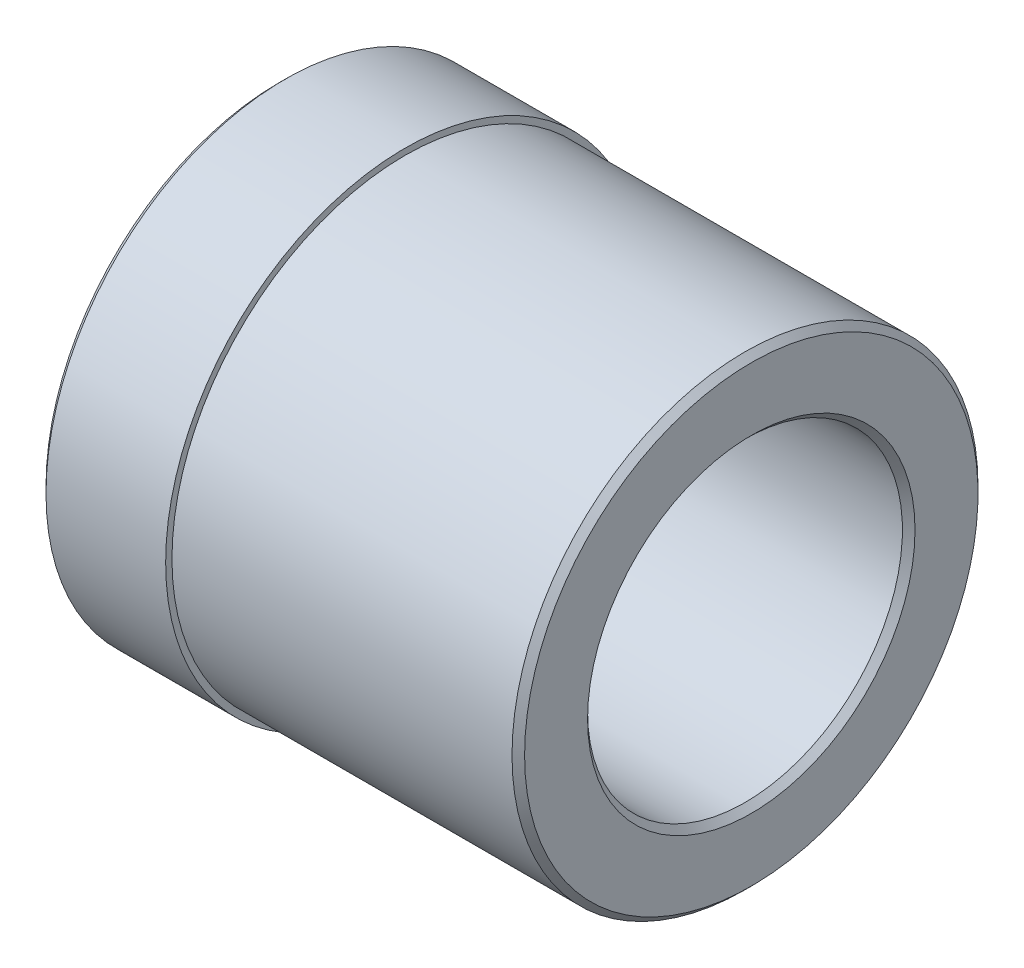
ISO-10303-21;
HEADER;
FILE_DESCRIPTION(('STEP AP214'),'2;1');
FILE_NAME('part.step','',(''),(''),'','','');
FILE_SCHEMA(('AUTOMOTIVE_DESIGN { 1 0 10303 214 1 1 1 1 }'));
ENDSEC;
DATA;
#1=APPLICATION_CONTEXT('core data for automotive mechanical design processes');
#2=APPLICATION_PROTOCOL_DEFINITION('international standard','automotive_design',2000,#1);
#3=PRODUCT_CONTEXT('',#1,'mechanical');
#4=PRODUCT('Part','Part','',(#3));
#5=PRODUCT_RELATED_PRODUCT_CATEGORY('part','',(#4));
#6=PRODUCT_DEFINITION_FORMATION('','',#4);
#7=PRODUCT_DEFINITION_CONTEXT('part definition',#1,'design');
#8=PRODUCT_DEFINITION('design','',#6,#7);
#9=PRODUCT_DEFINITION_SHAPE('','',#8);
#10=(LENGTH_UNIT() NAMED_UNIT(*) SI_UNIT(.MILLI.,.METRE.));
#11=(NAMED_UNIT(*) PLANE_ANGLE_UNIT() SI_UNIT($,.RADIAN.));
#12=(NAMED_UNIT(*) SI_UNIT($,.STERADIAN.) SOLID_ANGLE_UNIT());
#13=UNCERTAINTY_MEASURE_WITH_UNIT(LENGTH_MEASURE(1.E-05),#10,'distance_accuracy_value','');
#14=(GEOMETRIC_REPRESENTATION_CONTEXT(3) GLOBAL_UNCERTAINTY_ASSIGNED_CONTEXT((#13)) GLOBAL_UNIT_ASSIGNED_CONTEXT((#10,
#11,#12)) REPRESENTATION_CONTEXT('',''));
#15=CARTESIAN_POINT('',(0.,0.,0.));
#16=DIRECTION('',(0.,0.,1.));
#17=DIRECTION('',(1.,0.,0.));
#18=AXIS2_PLACEMENT_3D('',#15,#16,#17);
#19=CARTESIAN_POINT('',(0.,0.,0.));
#20=DIRECTION('',(-1.,0.,0.));
#21=DIRECTION('',(0.,0.,1.));
#22=AXIS2_PLACEMENT_3D('',#19,#20,#21);
#23=CYLINDRICAL_SURFACE('',#22,25.);
#24=CARTESIAN_POINT('',(1.00000000000001,0.,0.));
#25=DIRECTION('',(1.,0.,0.));
#26=DIRECTION('',(0.,0.,-1.));
#27=AXIS2_PLACEMENT_3D('',#24,#25,#26);
#28=CIRCLE('',#27,25.);
#29=CARTESIAN_POINT('',(1.00000000000001,0.,-25.));
#30=VERTEX_POINT('',#29);
#31=EDGE_CURVE('E58',#30,#30,#28,.F.);
#32=ORIENTED_EDGE('',*,*,#31,.T.);
#33=EDGE_LOOP('',(#32));
#34=FACE_BOUND('',#33,.T.);
#35=CARTESIAN_POINT('',(74.,0.,0.));
#36=DIRECTION('',(-1.,0.,0.));
#37=DIRECTION('',(0.,0.,1.));
#38=AXIS2_PLACEMENT_3D('',#35,#36,#37);
#39=CIRCLE('',#38,25.);
#40=CARTESIAN_POINT('',(74.,0.,25.));
#41=VERTEX_POINT('',#40);
#42=EDGE_CURVE('E61',#41,#41,#39,.F.);
#43=ORIENTED_EDGE('',*,*,#42,.T.);
#44=EDGE_LOOP('',(#43));
#45=FACE_BOUND('',#44,.T.);
#46=ADVANCED_FACE('F32',(#34,#45),#23,.F.);
#47=CARTESIAN_POINT('',(0.,25.,0.));
#48=DIRECTION('',(1.,0.,0.));
#49=DIRECTION('',(0.,0.,-1.));
#50=AXIS2_PLACEMENT_3D('',#47,#48,#49);
#51=PLANE('',#50);
#52=CARTESIAN_POINT('',(0.,0.,0.));
#53=DIRECTION('',(1.,0.,0.));
#54=DIRECTION('',(0.,0.,-1.));
#55=AXIS2_PLACEMENT_3D('',#52,#53,#54);
#56=CIRCLE('',#55,26.);
#57=CARTESIAN_POINT('',(0.,0.,-26.));
#58=VERTEX_POINT('',#57);
#59=EDGE_CURVE('E52',#58,#58,#56,.T.);
#60=ORIENTED_EDGE('',*,*,#59,.T.);
#61=EDGE_LOOP('',(#60));
#62=FACE_BOUND('',#61,.T.);
#63=CARTESIAN_POINT('',(0.,0.,0.));
#64=DIRECTION('',(1.,0.,0.));
#65=DIRECTION('',(0.,0.,-1.));
#66=AXIS2_PLACEMENT_3D('',#63,#64,#65);
#67=CIRCLE('',#66,37.);
#68=CARTESIAN_POINT('',(0.,0.,-37.));
#69=VERTEX_POINT('',#68);
#70=EDGE_CURVE('E55',#69,#69,#67,.F.);
#71=ORIENTED_EDGE('',*,*,#70,.T.);
#72=EDGE_LOOP('',(#71));
#73=FACE_BOUND('',#72,.T.);
#74=ADVANCED_FACE('F87',(#62,#73),#51,.F.);
#75=CARTESIAN_POINT('',(0.,0.,0.));
#76=DIRECTION('',(-1.,0.,0.));
#77=DIRECTION('',(0.,0.,1.));
#78=AXIS2_PLACEMENT_3D('',#75,#76,#77);
#79=CYLINDRICAL_SURFACE('',#78,38.);
#80=CARTESIAN_POINT('',(1.,0.,0.));
#81=DIRECTION('',(1.,0.,0.));
#82=DIRECTION('',(0.,0.,-1.));
#83=AXIS2_PLACEMENT_3D('',#80,#81,#82);
#84=CIRCLE('',#83,38.);
#85=CARTESIAN_POINT('',(1.,0.,-38.));
#86=VERTEX_POINT('',#85);
#87=EDGE_CURVE('E47',#86,#86,#84,.T.);
#88=ORIENTED_EDGE('',*,*,#87,.T.);
#89=EDGE_LOOP('',(#88));
#90=FACE_BOUND('',#89,.T.);
#91=CARTESIAN_POINT('',(20.,0.,0.));
#92=DIRECTION('',(-1.,0.,0.));
#93=DIRECTION('',(0.,0.,1.));
#94=AXIS2_PLACEMENT_3D('',#91,#92,#93);
#95=CIRCLE('',#94,38.);
#96=CARTESIAN_POINT('',(20.,0.,38.));
#97=VERTEX_POINT('',#96);
#98=EDGE_CURVE('E64',#97,#97,#95,.T.);
#99=ORIENTED_EDGE('',*,*,#98,.T.);
#100=EDGE_LOOP('',(#99));
#101=FACE_BOUND('',#100,.T.);
#102=ADVANCED_FACE('F83',(#90,#101),#79,.T.);
#103=CARTESIAN_POINT('',(20.,38.,0.));
#104=DIRECTION('',(-1.,0.,0.));
#105=DIRECTION('',(0.,0.,1.));
#106=AXIS2_PLACEMENT_3D('',#103,#104,#105);
#107=PLANE('',#106);
#108=ORIENTED_EDGE('',*,*,#98,.F.);
#109=EDGE_LOOP('',(#108));
#110=FACE_BOUND('',#109,.T.);
#111=CARTESIAN_POINT('',(20.,0.,0.));
#112=DIRECTION('',(-1.,0.,0.));
#113=DIRECTION('',(0.,0.,1.));
#114=AXIS2_PLACEMENT_3D('',#111,#112,#113);
#115=CIRCLE('',#114,37.);
#116=CARTESIAN_POINT('',(20.,0.,37.));
#117=VERTEX_POINT('',#116);
#118=EDGE_CURVE('E67',#117,#117,#115,.T.);
#119=ORIENTED_EDGE('',*,*,#118,.T.);
#120=EDGE_LOOP('',(#119));
#121=FACE_BOUND('',#120,.T.);
#122=ADVANCED_FACE('F71',(#110,#121),#107,.F.);
#123=CARTESIAN_POINT('',(0.,0.,0.));
#124=DIRECTION('',(-1.,0.,0.));
#125=DIRECTION('',(0.,0.,1.));
#126=AXIS2_PLACEMENT_3D('',#123,#124,#125);
#127=CYLINDRICAL_SURFACE('',#126,37.);
#128=CARTESIAN_POINT('',(74.,0.,0.));
#129=DIRECTION('',(-1.,0.,0.));
#130=DIRECTION('',(0.,0.,1.));
#131=AXIS2_PLACEMENT_3D('',#128,#129,#130);
#132=CIRCLE('',#131,37.);
#133=CARTESIAN_POINT('',(74.,0.,37.));
#134=VERTEX_POINT('',#133);
#135=EDGE_CURVE('E10',#134,#134,#132,.T.);
#136=ORIENTED_EDGE('',*,*,#135,.T.);
#137=EDGE_LOOP('',(#136));
#138=FACE_BOUND('',#137,.T.);
#139=ORIENTED_EDGE('',*,*,#118,.F.);
#140=EDGE_LOOP('',(#139));
#141=FACE_BOUND('',#140,.T.);
#142=ADVANCED_FACE('F73',(#138,#141),#127,.T.);
#143=CARTESIAN_POINT('',(75.,37.,0.));
#144=DIRECTION('',(-1.,0.,0.));
#145=DIRECTION('',(0.,0.,1.));
#146=AXIS2_PLACEMENT_3D('',#143,#144,#145);
#147=PLANE('',#146);
#148=CARTESIAN_POINT('',(75.,0.,0.));
#149=DIRECTION('',(-1.,0.,0.));
#150=DIRECTION('',(0.,0.,1.));
#151=AXIS2_PLACEMENT_3D('',#148,#149,#150);
#152=CIRCLE('',#151,26.);
#153=CARTESIAN_POINT('',(75.,0.,26.));
#154=VERTEX_POINT('',#153);
#155=EDGE_CURVE('E39',#154,#154,#152,.T.);
#156=ORIENTED_EDGE('',*,*,#155,.T.);
#157=EDGE_LOOP('',(#156));
#158=FACE_BOUND('',#157,.T.);
#159=CARTESIAN_POINT('',(75.,0.,0.));
#160=DIRECTION('',(-1.,0.,0.));
#161=DIRECTION('',(0.,0.,1.));
#162=AXIS2_PLACEMENT_3D('',#159,#160,#161);
#163=CIRCLE('',#162,36.);
#164=CARTESIAN_POINT('',(75.,0.,36.));
#165=VERTEX_POINT('',#164);
#166=EDGE_CURVE('E43',#165,#165,#163,.F.);
#167=ORIENTED_EDGE('',*,*,#166,.T.);
#168=EDGE_LOOP('',(#167));
#169=FACE_BOUND('',#168,.T.);
#170=ADVANCED_FACE('F75',(#158,#169),#147,.F.);
#171=CARTESIAN_POINT('',(1.00000000000001,0.,0.));
#172=DIRECTION('',(-1.,0.,0.));
#173=DIRECTION('',(0.,0.,1.));
#174=AXIS2_PLACEMENT_3D('',#171,#172,#173);
#175=CONICAL_SURFACE('',#174,25.,0.785398163397447);
#176=ORIENTED_EDGE('',*,*,#59,.F.);
#177=EDGE_LOOP('',(#176));
#178=FACE_BOUND('',#177,.T.);
#179=ORIENTED_EDGE('',*,*,#31,.F.);
#180=EDGE_LOOP('',(#179));
#181=FACE_BOUND('',#180,.T.);
#182=ADVANCED_FACE('F81',(#178,#181),#175,.F.);
#183=CARTESIAN_POINT('',(0.,0.,0.));
#184=DIRECTION('',(1.,0.,0.));
#185=DIRECTION('',(0.,0.,-1.));
#186=AXIS2_PLACEMENT_3D('',#183,#184,#185);
#187=CONICAL_SURFACE('',#186,37.,0.785398163397445);
#188=ORIENTED_EDGE('',*,*,#87,.F.);
#189=EDGE_LOOP('',(#188));
#190=FACE_BOUND('',#189,.T.);
#191=ORIENTED_EDGE('',*,*,#70,.F.);
#192=EDGE_LOOP('',(#191));
#193=FACE_BOUND('',#192,.T.);
#194=ADVANCED_FACE('F100',(#190,#193),#187,.T.);
#195=CARTESIAN_POINT('',(75.,0.,0.));
#196=DIRECTION('',(1.,0.,0.));
#197=DIRECTION('',(0.,0.,-1.));
#198=AXIS2_PLACEMENT_3D('',#195,#196,#197);
#199=CONICAL_SURFACE('',#198,26.,0.785398163397452);
#200=ORIENTED_EDGE('',*,*,#42,.F.);
#201=EDGE_LOOP('',(#200));
#202=FACE_BOUND('',#201,.T.);
#203=ORIENTED_EDGE('',*,*,#155,.F.);
#204=EDGE_LOOP('',(#203));
#205=FACE_BOUND('',#204,.T.);
#206=ADVANCED_FACE('F103',(#202,#205),#199,.F.);
#207=CARTESIAN_POINT('',(74.,0.,0.));
#208=DIRECTION('',(-1.,0.,0.));
#209=DIRECTION('',(0.,0.,1.));
#210=AXIS2_PLACEMENT_3D('',#207,#208,#209);
#211=CONICAL_SURFACE('',#210,37.,0.785398163397448);
#212=ORIENTED_EDGE('',*,*,#166,.F.);
#213=EDGE_LOOP('',(#212));
#214=FACE_BOUND('',#213,.T.);
#215=ORIENTED_EDGE('',*,*,#135,.F.);
#216=EDGE_LOOP('',(#215));
#217=FACE_BOUND('',#216,.T.);
#218=ADVANCED_FACE('F34',(#214,#217),#211,.T.);
#219=CLOSED_SHELL('',(#46,#74,#102,#122,#142,#170,#182,#194,#206,#218));
#220=MANIFOLD_SOLID_BREP('B2',#219);
#221=ADVANCED_BREP_SHAPE_REPRESENTATION('',(#18,#220),#14);
#222=SHAPE_DEFINITION_REPRESENTATION(#9,#221);
ENDSEC;
END-ISO-10303-21;
